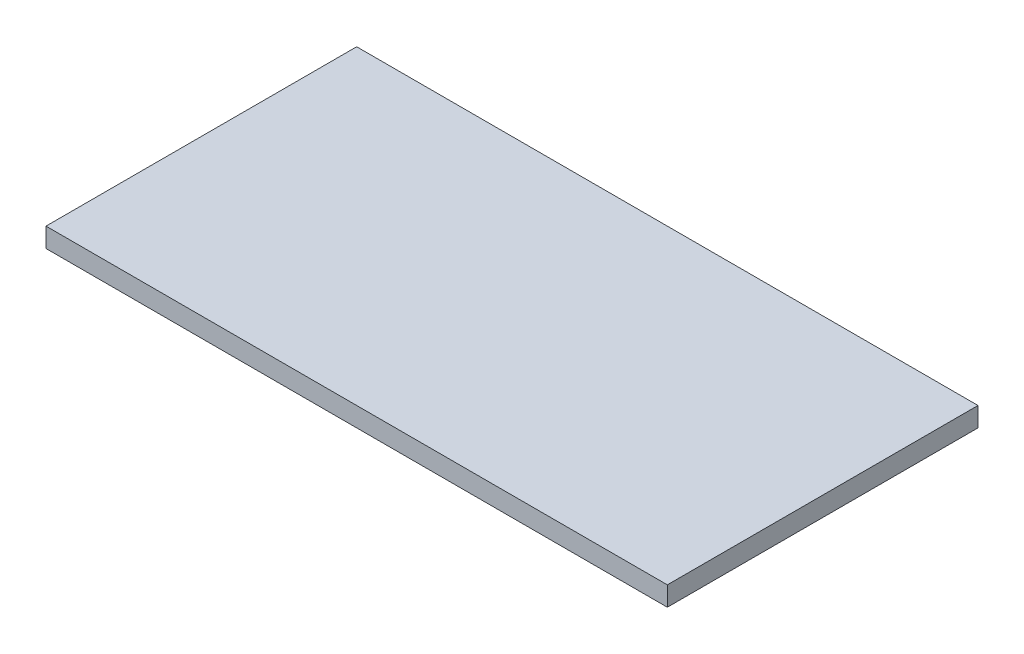
ISO-10303-21;
HEADER;
FILE_DESCRIPTION(('STEP AP214'),'2;1');
FILE_NAME('part.step','',(''),(''),'','','');
FILE_SCHEMA(('AUTOMOTIVE_DESIGN { 1 0 10303 214 1 1 1 1 }'));
ENDSEC;
DATA;
#1=APPLICATION_CONTEXT('core data for automotive mechanical design processes');
#2=APPLICATION_PROTOCOL_DEFINITION('international standard','automotive_design',2000,#1);
#3=PRODUCT_CONTEXT('',#1,'mechanical');
#4=PRODUCT('Part','Part','',(#3));
#5=PRODUCT_RELATED_PRODUCT_CATEGORY('part','',(#4));
#6=PRODUCT_DEFINITION_FORMATION('','',#4);
#7=PRODUCT_DEFINITION_CONTEXT('part definition',#1,'design');
#8=PRODUCT_DEFINITION('design','',#6,#7);
#9=PRODUCT_DEFINITION_SHAPE('','',#8);
#10=(LENGTH_UNIT() NAMED_UNIT(*) SI_UNIT(.MILLI.,.METRE.));
#11=(NAMED_UNIT(*) PLANE_ANGLE_UNIT() SI_UNIT($,.RADIAN.));
#12=(NAMED_UNIT(*) SI_UNIT($,.STERADIAN.) SOLID_ANGLE_UNIT());
#13=UNCERTAINTY_MEASURE_WITH_UNIT(LENGTH_MEASURE(1.E-05),#10,'distance_accuracy_value','');
#14=(GEOMETRIC_REPRESENTATION_CONTEXT(3) GLOBAL_UNCERTAINTY_ASSIGNED_CONTEXT((#13)) GLOBAL_UNIT_ASSIGNED_CONTEXT((#10,
#11,#12)) REPRESENTATION_CONTEXT('',''));
#15=CARTESIAN_POINT('',(0.,0.,0.));
#16=DIRECTION('',(0.,0.,1.));
#17=DIRECTION('',(1.,0.,0.));
#18=AXIS2_PLACEMENT_3D('',#15,#16,#17);
#19=CARTESIAN_POINT('',(50.8,3.175,25.4));
#20=DIRECTION('',(-1.,0.,0.));
#21=DIRECTION('',(0.,0.,1.));
#22=AXIS2_PLACEMENT_3D('',#19,#20,#21);
#23=PLANE('',#22);
#24=DIRECTION('',(0.,0.,-1.));
#25=VECTOR('',#24,1.);
#26=CARTESIAN_POINT('',(50.8,0.,25.4));
#27=LINE('',#26,#25);
#28=CARTESIAN_POINT('',(50.8,0.,25.4));
#29=VERTEX_POINT('',#28);
#30=CARTESIAN_POINT('',(50.8,0.,-25.4));
#31=VERTEX_POINT('',#30);
#32=EDGE_CURVE('E107',#29,#31,#27,.T.);
#33=ORIENTED_EDGE('',*,*,#32,.T.);
#34=DIRECTION('',(0.,-1.,0.));
#35=VECTOR('',#34,1.);
#36=CARTESIAN_POINT('',(50.8,3.175,-25.4));
#37=LINE('',#36,#35);
#38=CARTESIAN_POINT('',(50.8,3.175,-25.4));
#39=VERTEX_POINT('',#38);
#40=EDGE_CURVE('E11',#39,#31,#37,.T.);
#41=ORIENTED_EDGE('',*,*,#40,.F.);
#42=DIRECTION('',(0.,0.,-1.));
#43=VECTOR('',#42,1.);
#44=CARTESIAN_POINT('',(50.8,3.175,25.4));
#45=LINE('',#44,#43);
#46=CARTESIAN_POINT('',(50.8,3.175,25.4));
#47=VERTEX_POINT('',#46);
#48=EDGE_CURVE('E91',#47,#39,#45,.T.);
#49=ORIENTED_EDGE('',*,*,#48,.F.);
#50=DIRECTION('',(0.,-1.,0.));
#51=VECTOR('',#50,1.);
#52=CARTESIAN_POINT('',(50.8,3.175,25.4));
#53=LINE('',#52,#51);
#54=EDGE_CURVE('E103',#47,#29,#53,.T.);
#55=ORIENTED_EDGE('',*,*,#54,.T.);
#56=EDGE_LOOP('',(#33,#41,#49,#55));
#57=FACE_BOUND('',#56,.T.);
#58=ADVANCED_FACE('F39',(#57),#23,.F.);
#59=CARTESIAN_POINT('',(-50.8,3.175,-25.4));
#60=DIRECTION('',(0.,0.,1.));
#61=DIRECTION('',(1.,0.,0.));
#62=AXIS2_PLACEMENT_3D('',#59,#60,#61);
#63=PLANE('',#62);
#64=DIRECTION('',(-1.,0.,0.));
#65=VECTOR('',#64,1.);
#66=CARTESIAN_POINT('',(-50.8,0.,-25.4));
#67=LINE('',#66,#65);
#68=CARTESIAN_POINT('',(-50.8,0.,-25.4));
#69=VERTEX_POINT('',#68);
#70=EDGE_CURVE('E96',#31,#69,#67,.T.);
#71=ORIENTED_EDGE('',*,*,#70,.T.);
#72=DIRECTION('',(0.,-1.,0.));
#73=VECTOR('',#72,1.);
#74=CARTESIAN_POINT('',(-50.8,3.175,-25.4));
#75=LINE('',#74,#73);
#76=CARTESIAN_POINT('',(-50.8,3.175,-25.4));
#77=VERTEX_POINT('',#76);
#78=EDGE_CURVE('E48',#77,#69,#75,.T.);
#79=ORIENTED_EDGE('',*,*,#78,.F.);
#80=DIRECTION('',(-1.,0.,0.));
#81=VECTOR('',#80,1.);
#82=CARTESIAN_POINT('',(-50.8,3.175,-25.4));
#83=LINE('',#82,#81);
#84=EDGE_CURVE('E86',#39,#77,#83,.T.);
#85=ORIENTED_EDGE('',*,*,#84,.F.);
#86=ORIENTED_EDGE('',*,*,#40,.T.);
#87=EDGE_LOOP('',(#71,#79,#85,#86));
#88=FACE_BOUND('',#87,.T.);
#89=ADVANCED_FACE('F95',(#88),#63,.F.);
#90=CARTESIAN_POINT('',(-50.8,3.175,25.4));
#91=DIRECTION('',(1.,0.,0.));
#92=DIRECTION('',(0.,0.,-1.));
#93=AXIS2_PLACEMENT_3D('',#90,#91,#92);
#94=PLANE('',#93);
#95=DIRECTION('',(0.,0.,1.));
#96=VECTOR('',#95,1.);
#97=CARTESIAN_POINT('',(-50.8,0.,25.4));
#98=LINE('',#97,#96);
#99=CARTESIAN_POINT('',(-50.8,0.,25.4));
#100=VERTEX_POINT('',#99);
#101=EDGE_CURVE('E73',#69,#100,#98,.T.);
#102=ORIENTED_EDGE('',*,*,#101,.T.);
#103=DIRECTION('',(0.,-1.,0.));
#104=VECTOR('',#103,1.);
#105=CARTESIAN_POINT('',(-50.8,3.175,25.4));
#106=LINE('',#105,#104);
#107=CARTESIAN_POINT('',(-50.8,3.175,25.4));
#108=VERTEX_POINT('',#107);
#109=EDGE_CURVE('E98',#108,#100,#106,.T.);
#110=ORIENTED_EDGE('',*,*,#109,.F.);
#111=DIRECTION('',(0.,0.,1.));
#112=VECTOR('',#111,1.);
#113=CARTESIAN_POINT('',(-50.8,3.175,25.4));
#114=LINE('',#113,#112);
#115=EDGE_CURVE('E89',#77,#108,#114,.T.);
#116=ORIENTED_EDGE('',*,*,#115,.F.);
#117=ORIENTED_EDGE('',*,*,#78,.T.);
#118=EDGE_LOOP('',(#102,#110,#116,#117));
#119=FACE_BOUND('',#118,.T.);
#120=ADVANCED_FACE('F99',(#119),#94,.F.);
#121=CARTESIAN_POINT('',(-50.8,3.175,25.4));
#122=DIRECTION('',(0.,0.,-1.));
#123=DIRECTION('',(-1.,0.,0.));
#124=AXIS2_PLACEMENT_3D('',#121,#122,#123);
#125=PLANE('',#124);
#126=DIRECTION('',(1.,0.,0.));
#127=VECTOR('',#126,1.);
#128=CARTESIAN_POINT('',(-50.8,0.,25.4));
#129=LINE('',#128,#127);
#130=EDGE_CURVE('E79',#100,#29,#129,.T.);
#131=ORIENTED_EDGE('',*,*,#130,.T.);
#132=ORIENTED_EDGE('',*,*,#54,.F.);
#133=DIRECTION('',(1.,0.,0.));
#134=VECTOR('',#133,1.);
#135=CARTESIAN_POINT('',(-50.8,3.175,25.4));
#136=LINE('',#135,#134);
#137=EDGE_CURVE('E56',#108,#47,#136,.T.);
#138=ORIENTED_EDGE('',*,*,#137,.F.);
#139=ORIENTED_EDGE('',*,*,#109,.T.);
#140=EDGE_LOOP('',(#131,#132,#138,#139));
#141=FACE_BOUND('',#140,.T.);
#142=ADVANCED_FACE('F120',(#141),#125,.F.);
#143=CARTESIAN_POINT('',(0.,3.175,0.));
#144=DIRECTION('',(0.,-1.,0.));
#145=DIRECTION('',(0.,0.,-1.));
#146=AXIS2_PLACEMENT_3D('',#143,#144,#145);
#147=PLANE('',#146);
#148=ORIENTED_EDGE('',*,*,#48,.T.);
#149=ORIENTED_EDGE('',*,*,#84,.T.);
#150=ORIENTED_EDGE('',*,*,#115,.T.);
#151=ORIENTED_EDGE('',*,*,#137,.T.);
#152=EDGE_LOOP('',(#148,#149,#150,#151));
#153=FACE_BOUND('',#152,.T.);
#154=ADVANCED_FACE('F87',(#153),#147,.F.);
#155=CARTESIAN_POINT('',(0.,0.,0.));
#156=DIRECTION('',(0.,-1.,0.));
#157=DIRECTION('',(0.,0.,-1.));
#158=AXIS2_PLACEMENT_3D('',#155,#156,#157);
#159=PLANE('',#158);
#160=ORIENTED_EDGE('',*,*,#32,.F.);
#161=ORIENTED_EDGE('',*,*,#130,.F.);
#162=ORIENTED_EDGE('',*,*,#101,.F.);
#163=ORIENTED_EDGE('',*,*,#70,.F.);
#164=EDGE_LOOP('',(#160,#161,#162,#163));
#165=FACE_BOUND('',#164,.T.);
#166=ADVANCED_FACE('F123',(#165),#159,.T.);
#167=CLOSED_SHELL('',(#58,#89,#120,#142,#154,#166));
#168=MANIFOLD_SOLID_BREP('B2',#167);
#169=ADVANCED_BREP_SHAPE_REPRESENTATION('',(#18,#168),#14);
#170=SHAPE_DEFINITION_REPRESENTATION(#9,#169);
ENDSEC;
END-ISO-10303-21;
